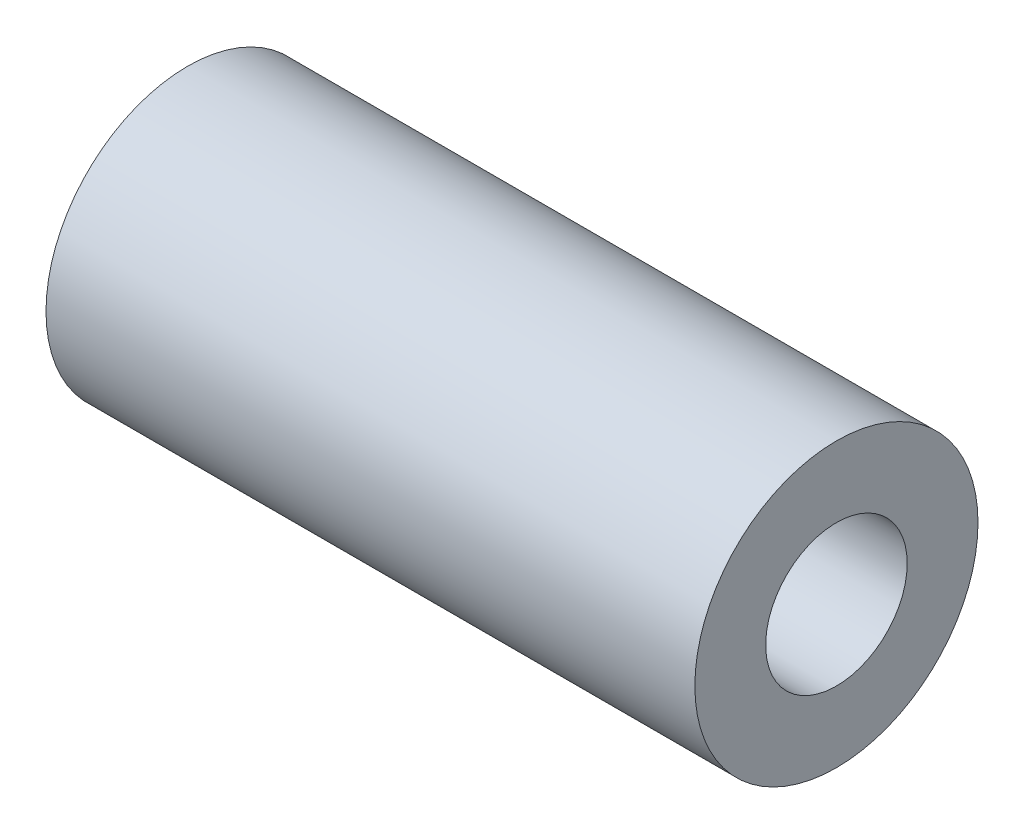
ISO-10303-21;
HEADER;
FILE_DESCRIPTION(('STEP AP214'),'2;1');
FILE_NAME('part.step','',(''),(''),'','','');
FILE_SCHEMA(('AUTOMOTIVE_DESIGN { 1 0 10303 214 1 1 1 1 }'));
ENDSEC;
DATA;
#1=APPLICATION_CONTEXT('core data for automotive mechanical design processes');
#2=APPLICATION_PROTOCOL_DEFINITION('international standard','automotive_design',2000,#1);
#3=PRODUCT_CONTEXT('',#1,'mechanical');
#4=PRODUCT('Part','Part','',(#3));
#5=PRODUCT_RELATED_PRODUCT_CATEGORY('part','',(#4));
#6=PRODUCT_DEFINITION_FORMATION('','',#4);
#7=PRODUCT_DEFINITION_CONTEXT('part definition',#1,'design');
#8=PRODUCT_DEFINITION('design','',#6,#7);
#9=PRODUCT_DEFINITION_SHAPE('','',#8);
#10=(LENGTH_UNIT() NAMED_UNIT(*) SI_UNIT(.MILLI.,.METRE.));
#11=(NAMED_UNIT(*) PLANE_ANGLE_UNIT() SI_UNIT($,.RADIAN.));
#12=(NAMED_UNIT(*) SI_UNIT($,.STERADIAN.) SOLID_ANGLE_UNIT());
#13=UNCERTAINTY_MEASURE_WITH_UNIT(LENGTH_MEASURE(1.E-05),#10,'distance_accuracy_value','');
#14=(GEOMETRIC_REPRESENTATION_CONTEXT(3) GLOBAL_UNCERTAINTY_ASSIGNED_CONTEXT((#13)) GLOBAL_UNIT_ASSIGNED_CONTEXT((#10,
#11,#12)) REPRESENTATION_CONTEXT('',''));
#15=CARTESIAN_POINT('',(0.,0.,0.));
#16=DIRECTION('',(0.,0.,1.));
#17=DIRECTION('',(1.,0.,0.));
#18=AXIS2_PLACEMENT_3D('',#15,#16,#17);
#19=CARTESIAN_POINT('',(-11.,0.,0.));
#20=DIRECTION('',(1.,0.,0.));
#21=DIRECTION('',(0.,0.,-1.));
#22=AXIS2_PLACEMENT_3D('',#19,#20,#21);
#23=CYLINDRICAL_SURFACE('',#22,2.4);
#24=CARTESIAN_POINT('',(-11.,0.,0.));
#25=DIRECTION('',(1.,0.,0.));
#26=DIRECTION('',(0.,0.,-1.));
#27=AXIS2_PLACEMENT_3D('',#24,#25,#26);
#28=CIRCLE('',#27,2.4);
#29=CARTESIAN_POINT('',(-11.,0.,-2.4));
#30=VERTEX_POINT('',#29);
#31=EDGE_CURVE('E10',#30,#30,#28,.T.);
#32=ORIENTED_EDGE('',*,*,#31,.T.);
#33=EDGE_LOOP('',(#32));
#34=FACE_BOUND('',#33,.T.);
#35=CARTESIAN_POINT('',(0.,0.,0.));
#36=DIRECTION('',(1.,0.,0.));
#37=DIRECTION('',(0.,0.,-1.));
#38=AXIS2_PLACEMENT_3D('',#35,#36,#37);
#39=CIRCLE('',#38,2.4);
#40=CARTESIAN_POINT('',(0.,0.,-2.4));
#41=VERTEX_POINT('',#40);
#42=EDGE_CURVE('E48',#41,#41,#39,.T.);
#43=ORIENTED_EDGE('',*,*,#42,.F.);
#44=EDGE_LOOP('',(#43));
#45=FACE_BOUND('',#44,.T.);
#46=ADVANCED_FACE('F45',(#34,#45),#23,.T.);
#47=CARTESIAN_POINT('',(-11.,0.,0.));
#48=DIRECTION('',(1.,0.,0.));
#49=DIRECTION('',(0.,0.,-1.));
#50=AXIS2_PLACEMENT_3D('',#47,#48,#49);
#51=PLANE('',#50);
#52=CARTESIAN_POINT('',(-11.,0.,0.));
#53=DIRECTION('',(1.,0.,0.));
#54=DIRECTION('',(0.,0.,-1.));
#55=AXIS2_PLACEMENT_3D('',#52,#53,#54);
#56=CIRCLE('',#55,1.2);
#57=CARTESIAN_POINT('',(-11.,0.,-1.2));
#58=VERTEX_POINT('',#57);
#59=EDGE_CURVE('E59',#58,#58,#56,.T.);
#60=ORIENTED_EDGE('',*,*,#59,.T.);
#61=EDGE_LOOP('',(#60));
#62=FACE_BOUND('',#61,.T.);
#63=ORIENTED_EDGE('',*,*,#31,.F.);
#64=EDGE_LOOP('',(#63));
#65=FACE_BOUND('',#64,.T.);
#66=ADVANCED_FACE('F69',(#62,#65),#51,.F.);
#67=CARTESIAN_POINT('',(0.,0.,0.));
#68=DIRECTION('',(1.,0.,0.));
#69=DIRECTION('',(0.,0.,-1.));
#70=AXIS2_PLACEMENT_3D('',#67,#68,#69);
#71=PLANE('',#70);
#72=CARTESIAN_POINT('',(0.,0.,0.));
#73=DIRECTION('',(1.,0.,0.));
#74=DIRECTION('',(0.,0.,-1.));
#75=AXIS2_PLACEMENT_3D('',#72,#73,#74);
#76=CIRCLE('',#75,1.2);
#77=CARTESIAN_POINT('',(0.,0.,-1.2));
#78=VERTEX_POINT('',#77);
#79=EDGE_CURVE('E61',#78,#78,#76,.T.);
#80=ORIENTED_EDGE('',*,*,#79,.F.);
#81=EDGE_LOOP('',(#80));
#82=FACE_BOUND('',#81,.T.);
#83=ORIENTED_EDGE('',*,*,#42,.T.);
#84=EDGE_LOOP('',(#83));
#85=FACE_BOUND('',#84,.T.);
#86=ADVANCED_FACE('F75',(#82,#85),#71,.T.);
#87=CARTESIAN_POINT('',(-11.,0.,0.));
#88=DIRECTION('',(1.,0.,0.));
#89=DIRECTION('',(0.,0.,-1.));
#90=AXIS2_PLACEMENT_3D('',#87,#88,#89);
#91=CYLINDRICAL_SURFACE('',#90,1.2);
#92=ORIENTED_EDGE('',*,*,#59,.F.);
#93=EDGE_LOOP('',(#92));
#94=FACE_BOUND('',#93,.T.);
#95=ORIENTED_EDGE('',*,*,#79,.T.);
#96=EDGE_LOOP('',(#95));
#97=FACE_BOUND('',#96,.T.);
#98=ADVANCED_FACE('F72',(#94,#97),#91,.F.);
#99=CLOSED_SHELL('',(#46,#66,#86,#98));
#100=MANIFOLD_SOLID_BREP('B2',#99);
#101=ADVANCED_BREP_SHAPE_REPRESENTATION('',(#18,#100),#14);
#102=SHAPE_DEFINITION_REPRESENTATION(#9,#101);
ENDSEC;
END-ISO-10303-21;
